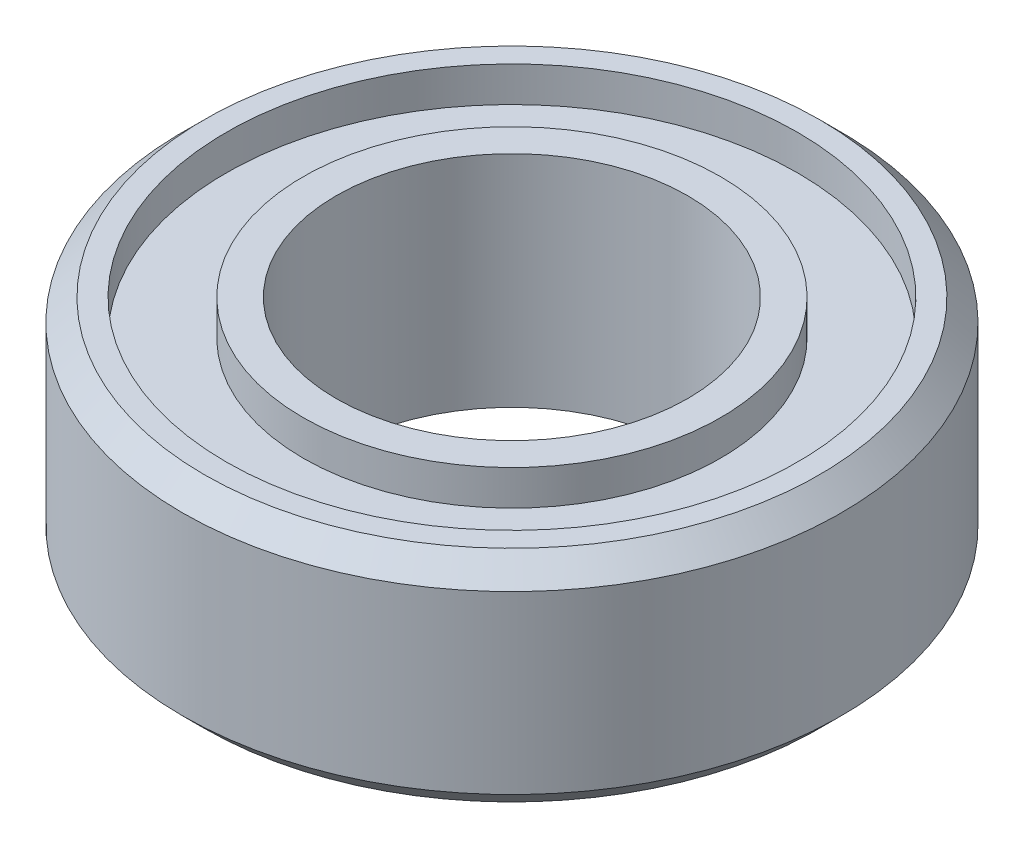
ISO-10303-21;
HEADER;
FILE_DESCRIPTION(('STEP AP214'),'2;1');
FILE_NAME('part.step','',(''),(''),'','','');
FILE_SCHEMA(('AUTOMOTIVE_DESIGN { 1 0 10303 214 1 1 1 1 }'));
ENDSEC;
DATA;
#1=APPLICATION_CONTEXT('core data for automotive mechanical design processes');
#2=APPLICATION_PROTOCOL_DEFINITION('international standard','automotive_design',2000,#1);
#3=PRODUCT_CONTEXT('',#1,'mechanical');
#4=PRODUCT('Part','Part','',(#3));
#5=PRODUCT_RELATED_PRODUCT_CATEGORY('part','',(#4));
#6=PRODUCT_DEFINITION_FORMATION('','',#4);
#7=PRODUCT_DEFINITION_CONTEXT('part definition',#1,'design');
#8=PRODUCT_DEFINITION('design','',#6,#7);
#9=PRODUCT_DEFINITION_SHAPE('','',#8);
#10=(LENGTH_UNIT() NAMED_UNIT(*) SI_UNIT(.MILLI.,.METRE.));
#11=(NAMED_UNIT(*) PLANE_ANGLE_UNIT() SI_UNIT($,.RADIAN.));
#12=(NAMED_UNIT(*) SI_UNIT($,.STERADIAN.) SOLID_ANGLE_UNIT());
#13=UNCERTAINTY_MEASURE_WITH_UNIT(LENGTH_MEASURE(1.E-05),#10,'distance_accuracy_value','');
#14=(GEOMETRIC_REPRESENTATION_CONTEXT(3) GLOBAL_UNCERTAINTY_ASSIGNED_CONTEXT((#13)) GLOBAL_UNIT_ASSIGNED_CONTEXT((#10,
#11,#12)) REPRESENTATION_CONTEXT('',''));
#15=CARTESIAN_POINT('',(0.,0.,0.));
#16=DIRECTION('',(0.,0.,1.));
#17=DIRECTION('',(1.,0.,0.));
#18=AXIS2_PLACEMENT_3D('',#15,#16,#17);
#19=CARTESIAN_POINT('',(0.,0.,0.));
#20=DIRECTION('',(0.,1.,0.));
#21=DIRECTION('',(0.,0.,1.));
#22=AXIS2_PLACEMENT_3D('',#19,#20,#21);
#23=PLANE('',#22);
#24=CARTESIAN_POINT('',(0.,0.,0.));
#25=DIRECTION('',(0.,1.,0.));
#26=DIRECTION('',(0.,0.,1.));
#27=AXIS2_PLACEMENT_3D('',#24,#25,#26);
#28=CIRCLE('',#27,4.);
#29=CARTESIAN_POINT('',(0.,0.,4.));
#30=VERTEX_POINT('',#29);
#31=EDGE_CURVE('E57',#30,#30,#28,.T.);
#32=ORIENTED_EDGE('',*,*,#31,.T.);
#33=EDGE_LOOP('',(#32));
#34=FACE_BOUND('',#33,.T.);
#35=CARTESIAN_POINT('',(0.,0.,0.));
#36=DIRECTION('',(0.,-1.,0.));
#37=DIRECTION('',(0.,0.,-1.));
#38=AXIS2_PLACEMENT_3D('',#35,#36,#37);
#39=CIRCLE('',#38,4.75);
#40=CARTESIAN_POINT('',(0.,0.,-4.75));
#41=VERTEX_POINT('',#40);
#42=EDGE_CURVE('E81',#41,#41,#39,.T.);
#43=ORIENTED_EDGE('',*,*,#42,.T.);
#44=EDGE_LOOP('',(#43));
#45=FACE_BOUND('',#44,.T.);
#46=ADVANCED_FACE('F36',(#34,#45),#23,.F.);
#47=CARTESIAN_POINT('',(0.,5.,0.));
#48=DIRECTION('',(0.,1.,0.));
#49=DIRECTION('',(0.,0.,1.));
#50=AXIS2_PLACEMENT_3D('',#47,#48,#49);
#51=PLANE('',#50);
#52=CARTESIAN_POINT('',(0.,5.,0.));
#53=DIRECTION('',(0.,1.,0.));
#54=DIRECTION('',(0.,0.,1.));
#55=AXIS2_PLACEMENT_3D('',#52,#53,#54);
#56=CIRCLE('',#55,4.);
#57=CARTESIAN_POINT('',(0.,5.,4.));
#58=VERTEX_POINT('',#57);
#59=EDGE_CURVE('E56',#58,#58,#56,.T.);
#60=ORIENTED_EDGE('',*,*,#59,.F.);
#61=EDGE_LOOP('',(#60));
#62=FACE_BOUND('',#61,.T.);
#63=CARTESIAN_POINT('',(0.,5.,0.));
#64=DIRECTION('',(0.,1.,0.));
#65=DIRECTION('',(0.,0.,1.));
#66=AXIS2_PLACEMENT_3D('',#63,#64,#65);
#67=CIRCLE('',#66,4.75);
#68=CARTESIAN_POINT('',(0.,5.,4.75));
#69=VERTEX_POINT('',#68);
#70=EDGE_CURVE('E69',#69,#69,#67,.T.);
#71=ORIENTED_EDGE('',*,*,#70,.T.);
#72=EDGE_LOOP('',(#71));
#73=FACE_BOUND('',#72,.T.);
#74=ADVANCED_FACE('F114',(#62,#73),#51,.T.);
#75=CARTESIAN_POINT('',(0.,5.,0.));
#76=DIRECTION('',(0.,1.,0.));
#77=DIRECTION('',(0.,0.,1.));
#78=AXIS2_PLACEMENT_3D('',#75,#76,#77);
#79=CIRCLE('',#78,6.5);
#80=CARTESIAN_POINT('',(0.,5.,6.5));
#81=VERTEX_POINT('',#80);
#82=EDGE_CURVE('E63',#81,#81,#79,.T.);
#83=ORIENTED_EDGE('',*,*,#82,.F.);
#84=EDGE_LOOP('',(#83));
#85=FACE_BOUND('',#84,.T.);
#86=CARTESIAN_POINT('',(0.,5.,0.));
#87=DIRECTION('',(0.,1.,0.));
#88=DIRECTION('',(0.,0.,1.));
#89=AXIS2_PLACEMENT_3D('',#86,#87,#88);
#90=CIRCLE('',#89,7.);
#91=CARTESIAN_POINT('',(0.,5.,7.));
#92=VERTEX_POINT('',#91);
#93=EDGE_CURVE('E51',#92,#92,#90,.T.);
#94=ORIENTED_EDGE('',*,*,#93,.T.);
#95=EDGE_LOOP('',(#94));
#96=FACE_BOUND('',#95,.T.);
#97=ADVANCED_FACE('F106',(#85,#96),#51,.T.);
#98=CARTESIAN_POINT('',(0.,0.,0.));
#99=DIRECTION('',(0.,-1.,0.));
#100=DIRECTION('',(0.,0.,-1.));
#101=AXIS2_PLACEMENT_3D('',#98,#99,#100);
#102=CIRCLE('',#101,6.5);
#103=CARTESIAN_POINT('',(0.,0.,-6.5));
#104=VERTEX_POINT('',#103);
#105=EDGE_CURVE('E75',#104,#104,#102,.T.);
#106=ORIENTED_EDGE('',*,*,#105,.F.);
#107=EDGE_LOOP('',(#106));
#108=FACE_BOUND('',#107,.T.);
#109=CARTESIAN_POINT('',(0.,0.,0.));
#110=DIRECTION('',(0.,1.,0.));
#111=DIRECTION('',(0.,0.,1.));
#112=AXIS2_PLACEMENT_3D('',#109,#110,#111);
#113=CIRCLE('',#112,7.);
#114=CARTESIAN_POINT('',(0.,0.,7.));
#115=VERTEX_POINT('',#114);
#116=EDGE_CURVE('E10',#115,#115,#113,.F.);
#117=ORIENTED_EDGE('',*,*,#116,.T.);
#118=EDGE_LOOP('',(#117));
#119=FACE_BOUND('',#118,.T.);
#120=ADVANCED_FACE('F103',(#108,#119),#23,.F.);
#121=CARTESIAN_POINT('',(0.,5.,0.));
#122=DIRECTION('',(0.,-1.,0.));
#123=DIRECTION('',(0.,0.,-1.));
#124=AXIS2_PLACEMENT_3D('',#121,#122,#123);
#125=CYLINDRICAL_SURFACE('',#124,7.5);
#126=CARTESIAN_POINT('',(0.,0.5,0.));
#127=DIRECTION('',(0.,1.,0.));
#128=DIRECTION('',(0.,0.,1.));
#129=AXIS2_PLACEMENT_3D('',#126,#127,#128);
#130=CIRCLE('',#129,7.5);
#131=CARTESIAN_POINT('',(0.,0.5,7.5));
#132=VERTEX_POINT('',#131);
#133=EDGE_CURVE('E43',#132,#132,#130,.T.);
#134=ORIENTED_EDGE('',*,*,#133,.T.);
#135=EDGE_LOOP('',(#134));
#136=FACE_BOUND('',#135,.T.);
#137=CARTESIAN_POINT('',(0.,4.5,0.));
#138=DIRECTION('',(0.,1.,0.));
#139=DIRECTION('',(0.,0.,1.));
#140=AXIS2_PLACEMENT_3D('',#137,#138,#139);
#141=CIRCLE('',#140,7.5);
#142=CARTESIAN_POINT('',(0.,4.5,7.5));
#143=VERTEX_POINT('',#142);
#144=EDGE_CURVE('E47',#143,#143,#141,.F.);
#145=ORIENTED_EDGE('',*,*,#144,.T.);
#146=EDGE_LOOP('',(#145));
#147=FACE_BOUND('',#146,.T.);
#148=ADVANCED_FACE('F105',(#136,#147),#125,.T.);
#149=CARTESIAN_POINT('',(0.,5.,0.));
#150=DIRECTION('',(0.,-1.,0.));
#151=DIRECTION('',(0.,0.,-1.));
#152=AXIS2_PLACEMENT_3D('',#149,#150,#151);
#153=CYLINDRICAL_SURFACE('',#152,4.);
#154=ORIENTED_EDGE('',*,*,#59,.T.);
#155=EDGE_LOOP('',(#154));
#156=FACE_BOUND('',#155,.T.);
#157=ORIENTED_EDGE('',*,*,#31,.F.);
#158=EDGE_LOOP('',(#157));
#159=FACE_BOUND('',#158,.T.);
#160=ADVANCED_FACE('F112',(#156,#159),#153,.F.);
#161=CARTESIAN_POINT('',(0.,5.,0.));
#162=DIRECTION('',(0.,-1.,0.));
#163=DIRECTION('',(0.,0.,-1.));
#164=AXIS2_PLACEMENT_3D('',#161,#162,#163);
#165=CONICAL_SURFACE('',#164,7.,0.785398163397447);
#166=ORIENTED_EDGE('',*,*,#144,.F.);
#167=EDGE_LOOP('',(#166));
#168=FACE_BOUND('',#167,.T.);
#169=ORIENTED_EDGE('',*,*,#93,.F.);
#170=EDGE_LOOP('',(#169));
#171=FACE_BOUND('',#170,.T.);
#172=ADVANCED_FACE('F143',(#168,#171),#165,.T.);
#173=CARTESIAN_POINT('',(0.,0.5,0.));
#174=DIRECTION('',(0.,1.,0.));
#175=DIRECTION('',(0.,0.,1.));
#176=AXIS2_PLACEMENT_3D('',#173,#174,#175);
#177=CONICAL_SURFACE('',#176,7.5,0.78539816339745);
#178=ORIENTED_EDGE('',*,*,#116,.F.);
#179=EDGE_LOOP('',(#178));
#180=FACE_BOUND('',#179,.T.);
#181=ORIENTED_EDGE('',*,*,#133,.F.);
#182=EDGE_LOOP('',(#181));
#183=FACE_BOUND('',#182,.T.);
#184=ADVANCED_FACE('F38',(#180,#183),#177,.T.);
#185=CARTESIAN_POINT('',(0.,4.2,0.));
#186=DIRECTION('',(0.,1.,0.));
#187=DIRECTION('',(0.,0.,1.));
#188=AXIS2_PLACEMENT_3D('',#185,#186,#187);
#189=CYLINDRICAL_SURFACE('',#188,6.5);
#190=CARTESIAN_POINT('',(0.,4.2,0.));
#191=DIRECTION('',(0.,1.,0.));
#192=DIRECTION('',(0.,0.,1.));
#193=AXIS2_PLACEMENT_3D('',#190,#191,#192);
#194=CIRCLE('',#193,6.5);
#195=CARTESIAN_POINT('',(0.,4.2,6.5));
#196=VERTEX_POINT('',#195);
#197=EDGE_CURVE('E60',#196,#196,#194,.T.);
#198=ORIENTED_EDGE('',*,*,#197,.F.);
#199=EDGE_LOOP('',(#198));
#200=FACE_BOUND('',#199,.T.);
#201=ORIENTED_EDGE('',*,*,#82,.T.);
#202=EDGE_LOOP('',(#201));
#203=FACE_BOUND('',#202,.T.);
#204=ADVANCED_FACE('F137',(#200,#203),#189,.F.);
#205=CARTESIAN_POINT('',(0.,4.2,0.));
#206=DIRECTION('',(0.,1.,0.));
#207=DIRECTION('',(0.,0.,1.));
#208=AXIS2_PLACEMENT_3D('',#205,#206,#207);
#209=PLANE('',#208);
#210=CARTESIAN_POINT('',(0.,4.2,0.));
#211=DIRECTION('',(0.,1.,0.));
#212=DIRECTION('',(0.,0.,1.));
#213=AXIS2_PLACEMENT_3D('',#210,#211,#212);
#214=CIRCLE('',#213,4.75);
#215=CARTESIAN_POINT('',(0.,4.2,4.75));
#216=VERTEX_POINT('',#215);
#217=EDGE_CURVE('E66',#216,#216,#214,.T.);
#218=ORIENTED_EDGE('',*,*,#217,.F.);
#219=EDGE_LOOP('',(#218));
#220=FACE_BOUND('',#219,.T.);
#221=ORIENTED_EDGE('',*,*,#197,.T.);
#222=EDGE_LOOP('',(#221));
#223=FACE_BOUND('',#222,.T.);
#224=ADVANCED_FACE('F133',(#220,#223),#209,.T.);
#225=CARTESIAN_POINT('',(0.,4.2,0.));
#226=DIRECTION('',(0.,1.,0.));
#227=DIRECTION('',(0.,0.,1.));
#228=AXIS2_PLACEMENT_3D('',#225,#226,#227);
#229=CYLINDRICAL_SURFACE('',#228,4.75);
#230=ORIENTED_EDGE('',*,*,#217,.T.);
#231=EDGE_LOOP('',(#230));
#232=FACE_BOUND('',#231,.T.);
#233=ORIENTED_EDGE('',*,*,#70,.F.);
#234=EDGE_LOOP('',(#233));
#235=FACE_BOUND('',#234,.T.);
#236=ADVANCED_FACE('F99',(#232,#235),#229,.T.);
#237=CARTESIAN_POINT('',(0.,0.8,0.));
#238=DIRECTION('',(0.,-1.,0.));
#239=DIRECTION('',(0.,0.,-1.));
#240=AXIS2_PLACEMENT_3D('',#237,#238,#239);
#241=CYLINDRICAL_SURFACE('',#240,6.5);
#242=CARTESIAN_POINT('',(0.,0.8,0.));
#243=DIRECTION('',(0.,-1.,0.));
#244=DIRECTION('',(0.,0.,-1.));
#245=AXIS2_PLACEMENT_3D('',#242,#243,#244);
#246=CIRCLE('',#245,6.5);
#247=CARTESIAN_POINT('',(0.,0.8,-6.5));
#248=VERTEX_POINT('',#247);
#249=EDGE_CURVE('E72',#248,#248,#246,.T.);
#250=ORIENTED_EDGE('',*,*,#249,.F.);
#251=EDGE_LOOP('',(#250));
#252=FACE_BOUND('',#251,.T.);
#253=ORIENTED_EDGE('',*,*,#105,.T.);
#254=EDGE_LOOP('',(#253));
#255=FACE_BOUND('',#254,.T.);
#256=ADVANCED_FACE('F93',(#252,#255),#241,.F.);
#257=CARTESIAN_POINT('',(0.,0.8,0.));
#258=DIRECTION('',(0.,-1.,0.));
#259=DIRECTION('',(0.,0.,-1.));
#260=AXIS2_PLACEMENT_3D('',#257,#258,#259);
#261=PLANE('',#260);
#262=CARTESIAN_POINT('',(0.,0.8,0.));
#263=DIRECTION('',(0.,-1.,0.));
#264=DIRECTION('',(0.,0.,-1.));
#265=AXIS2_PLACEMENT_3D('',#262,#263,#264);
#266=CIRCLE('',#265,4.75);
#267=CARTESIAN_POINT('',(0.,0.8,-4.75));
#268=VERTEX_POINT('',#267);
#269=EDGE_CURVE('E78',#268,#268,#266,.T.);
#270=ORIENTED_EDGE('',*,*,#269,.F.);
#271=EDGE_LOOP('',(#270));
#272=FACE_BOUND('',#271,.T.);
#273=ORIENTED_EDGE('',*,*,#249,.T.);
#274=EDGE_LOOP('',(#273));
#275=FACE_BOUND('',#274,.T.);
#276=ADVANCED_FACE('F90',(#272,#275),#261,.T.);
#277=CARTESIAN_POINT('',(0.,0.8,0.));
#278=DIRECTION('',(0.,-1.,0.));
#279=DIRECTION('',(0.,0.,-1.));
#280=AXIS2_PLACEMENT_3D('',#277,#278,#279);
#281=CYLINDRICAL_SURFACE('',#280,4.75);
#282=ORIENTED_EDGE('',*,*,#269,.T.);
#283=EDGE_LOOP('',(#282));
#284=FACE_BOUND('',#283,.T.);
#285=ORIENTED_EDGE('',*,*,#42,.F.);
#286=EDGE_LOOP('',(#285));
#287=FACE_BOUND('',#286,.T.);
#288=ADVANCED_FACE('F87',(#284,#287),#281,.T.);
#289=CLOSED_SHELL('',(#46,#74,#97,#120,#148,#160,#172,#184,#204,#224,#236,#256,#276,#288));
#290=MANIFOLD_SOLID_BREP('B2',#289);
#291=ADVANCED_BREP_SHAPE_REPRESENTATION('',(#18,#290),#14);
#292=SHAPE_DEFINITION_REPRESENTATION(#9,#291);
ENDSEC;
END-ISO-10303-21;
